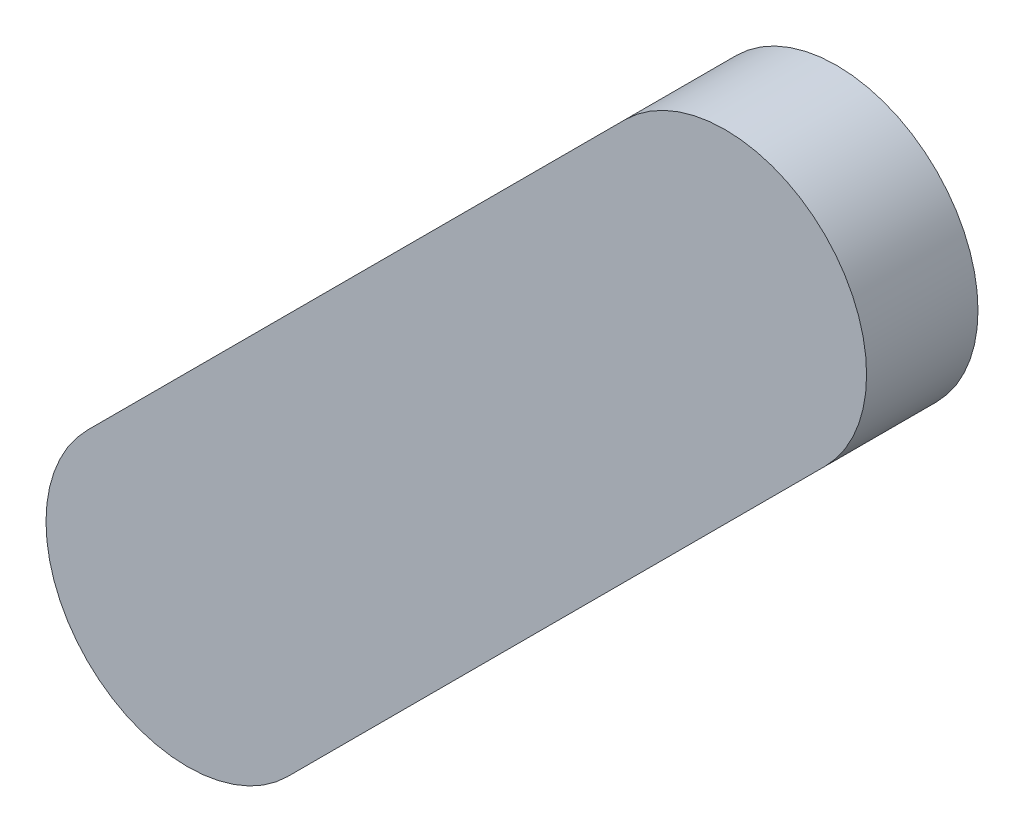
ISO-10303-21;
HEADER;
FILE_DESCRIPTION(('STEP AP214'),'2;1');
FILE_NAME('part.step','',(''),(''),'','','');
FILE_SCHEMA(('AUTOMOTIVE_DESIGN { 1 0 10303 214 1 1 1 1 }'));
ENDSEC;
DATA;
#1=APPLICATION_CONTEXT('core data for automotive mechanical design processes');
#2=APPLICATION_PROTOCOL_DEFINITION('international standard','automotive_design',2000,#1);
#3=PRODUCT_CONTEXT('',#1,'mechanical');
#4=PRODUCT('Part','Part','',(#3));
#5=PRODUCT_RELATED_PRODUCT_CATEGORY('part','',(#4));
#6=PRODUCT_DEFINITION_FORMATION('','',#4);
#7=PRODUCT_DEFINITION_CONTEXT('part definition',#1,'design');
#8=PRODUCT_DEFINITION('design','',#6,#7);
#9=PRODUCT_DEFINITION_SHAPE('','',#8);
#10=(LENGTH_UNIT() NAMED_UNIT(*) SI_UNIT(.MILLI.,.METRE.));
#11=(NAMED_UNIT(*) PLANE_ANGLE_UNIT() SI_UNIT($,.RADIAN.));
#12=(NAMED_UNIT(*) SI_UNIT($,.STERADIAN.) SOLID_ANGLE_UNIT());
#13=UNCERTAINTY_MEASURE_WITH_UNIT(LENGTH_MEASURE(1.E-05),#10,'distance_accuracy_value','');
#14=(GEOMETRIC_REPRESENTATION_CONTEXT(3) GLOBAL_UNCERTAINTY_ASSIGNED_CONTEXT((#13)) GLOBAL_UNIT_ASSIGNED_CONTEXT((#10,
#11,#12)) REPRESENTATION_CONTEXT('',''));
#15=CARTESIAN_POINT('',(0.,0.,0.));
#16=DIRECTION('',(0.,0.,1.));
#17=DIRECTION('',(1.,0.,0.));
#18=AXIS2_PLACEMENT_3D('',#15,#16,#17);
#19=CARTESIAN_POINT('',(147.8044034,106.62739406,0.));
#20=DIRECTION('',(-0.707106781186563,0.707106781186532,0.));
#21=DIRECTION('',(0.707106781186532,0.707106781186563,0.));
#22=AXIS2_PLACEMENT_3D('',#19,#20,#21);
#23=PLANE('',#22);
#24=DIRECTION('',(0.707106781186532,0.707106781186563,0.));
#25=VECTOR('',#24,1.);
#26=CARTESIAN_POINT('',(147.8044034,106.62739406,0.1999996));
#27=LINE('',#26,#25);
#28=CARTESIAN_POINT('',(147.8044034,106.62739406,0.1999996));
#29=VERTEX_POINT('',#28);
#30=CARTESIAN_POINT('',(148.76960594,107.5925966,0.1999996));
#31=VERTEX_POINT('',#30);
#32=EDGE_CURVE('E11',#29,#31,#27,.T.);
#33=ORIENTED_EDGE('',*,*,#32,.F.);
#34=DIRECTION('',(0.,0.,1.));
#35=VECTOR('',#34,1.);
#36=CARTESIAN_POINT('',(147.8044034,106.62739406,0.));
#37=LINE('',#36,#35);
#38=CARTESIAN_POINT('',(147.8044034,106.62739406,0.));
#39=VERTEX_POINT('',#38);
#40=EDGE_CURVE('E24',#39,#29,#37,.T.);
#41=ORIENTED_EDGE('',*,*,#40,.F.);
#42=DIRECTION('',(0.707106781186532,0.707106781186563,0.));
#43=VECTOR('',#42,1.);
#44=CARTESIAN_POINT('',(147.8044034,106.62739406,0.));
#45=LINE('',#44,#43);
#46=CARTESIAN_POINT('',(148.76960594,107.5925966,0.));
#47=VERTEX_POINT('',#46);
#48=EDGE_CURVE('E75',#39,#47,#45,.T.);
#49=ORIENTED_EDGE('',*,*,#48,.T.);
#50=DIRECTION('',(0.,0.,1.));
#51=VECTOR('',#50,1.);
#52=CARTESIAN_POINT('',(148.76960594,107.5925966,0.));
#53=LINE('',#52,#51);
#54=EDGE_CURVE('E37',#47,#31,#53,.T.);
#55=ORIENTED_EDGE('',*,*,#54,.T.);
#56=EDGE_LOOP('',(#33,#41,#49,#55));
#57=FACE_BOUND('',#56,.T.);
#58=ADVANCED_FACE('F17',(#57),#23,.F.);
#59=CARTESIAN_POINT('',(148.59000127,107.77220127,0.));
#60=DIRECTION('',(0.,0.,-1.));
#61=DIRECTION('',(0.70710678118652,-0.707106781186576,0.));
#62=AXIS2_PLACEMENT_3D('',#59,#60,#61);
#63=CYLINDRICAL_SURFACE('',#62,0.253999360179526);
#64=CARTESIAN_POINT('',(148.59000127,107.77220127,0.1999996));
#65=DIRECTION('',(0.,0.,1.));
#66=DIRECTION('',(0.70710678118652,-0.707106781186576,0.));
#67=AXIS2_PLACEMENT_3D('',#64,#65,#66);
#68=CIRCLE('',#67,0.253999360179526);
#69=CARTESIAN_POINT('',(148.4103966,107.95180594,0.1999996));
#70=VERTEX_POINT('',#69);
#71=EDGE_CURVE('E83',#31,#70,#68,.T.);
#72=ORIENTED_EDGE('',*,*,#71,.F.);
#73=ORIENTED_EDGE('',*,*,#54,.F.);
#74=CARTESIAN_POINT('',(148.59000127,107.77220127,0.));
#75=DIRECTION('',(0.,0.,1.));
#76=DIRECTION('',(0.70710678118652,-0.707106781186576,0.));
#77=AXIS2_PLACEMENT_3D('',#74,#75,#76);
#78=CIRCLE('',#77,0.253999360179526);
#79=CARTESIAN_POINT('',(148.4103966,107.95180594,0.));
#80=VERTEX_POINT('',#79);
#81=EDGE_CURVE('E81',#47,#80,#78,.T.);
#82=ORIENTED_EDGE('',*,*,#81,.T.);
#83=DIRECTION('',(0.,0.,1.));
#84=VECTOR('',#83,1.);
#85=CARTESIAN_POINT('',(148.4103966,107.95180594,0.));
#86=LINE('',#85,#84);
#87=EDGE_CURVE('E67',#80,#70,#86,.T.);
#88=ORIENTED_EDGE('',*,*,#87,.T.);
#89=EDGE_LOOP('',(#72,#73,#82,#88));
#90=FACE_BOUND('',#89,.T.);
#91=ADVANCED_FACE('F89',(#90),#63,.T.);
#92=CARTESIAN_POINT('',(148.4103966,107.95180594,0.));
#93=DIRECTION('',(0.707106781186532,-0.707106781186563,0.));
#94=DIRECTION('',(-0.707106781186563,-0.707106781186532,0.));
#95=AXIS2_PLACEMENT_3D('',#92,#93,#94);
#96=PLANE('',#95);
#97=DIRECTION('',(-0.707106781186563,-0.707106781186532,0.));
#98=VECTOR('',#97,1.);
#99=CARTESIAN_POINT('',(148.4103966,107.95180594,0.1999996));
#100=LINE('',#99,#98);
#101=CARTESIAN_POINT('',(147.44519406,106.9866034,0.1999996));
#102=VERTEX_POINT('',#101);
#103=EDGE_CURVE('E71',#70,#102,#100,.T.);
#104=ORIENTED_EDGE('',*,*,#103,.F.);
#105=ORIENTED_EDGE('',*,*,#87,.F.);
#106=DIRECTION('',(-0.707106781186563,-0.707106781186532,0.));
#107=VECTOR('',#106,1.);
#108=CARTESIAN_POINT('',(148.4103966,107.95180594,0.));
#109=LINE('',#108,#107);
#110=CARTESIAN_POINT('',(147.44519406,106.9866034,0.));
#111=VERTEX_POINT('',#110);
#112=EDGE_CURVE('E63',#80,#111,#109,.T.);
#113=ORIENTED_EDGE('',*,*,#112,.T.);
#114=DIRECTION('',(0.,0.,1.));
#115=VECTOR('',#114,1.);
#116=CARTESIAN_POINT('',(147.44519406,106.9866034,0.));
#117=LINE('',#116,#115);
#118=EDGE_CURVE('E53',#111,#102,#117,.T.);
#119=ORIENTED_EDGE('',*,*,#118,.T.);
#120=EDGE_LOOP('',(#104,#105,#113,#119));
#121=FACE_BOUND('',#120,.T.);
#122=ADVANCED_FACE('F66',(#121),#96,.F.);
#123=CARTESIAN_POINT('',(147.62479873,106.80699873,0.));
#124=DIRECTION('',(0.,0.,-1.));
#125=DIRECTION('',(-0.707106781186604,0.707106781186492,0.));
#126=AXIS2_PLACEMENT_3D('',#123,#124,#125);
#127=CYLINDRICAL_SURFACE('',#126,0.253999360179562);
#128=CARTESIAN_POINT('',(147.62479873,106.80699873,0.1999996));
#129=DIRECTION('',(0.,0.,1.));
#130=DIRECTION('',(-0.707106781186604,0.707106781186492,0.));
#131=AXIS2_PLACEMENT_3D('',#128,#129,#130);
#132=CIRCLE('',#131,0.253999360179562);
#133=EDGE_CURVE('E59',#102,#29,#132,.T.);
#134=ORIENTED_EDGE('',*,*,#133,.F.);
#135=ORIENTED_EDGE('',*,*,#118,.F.);
#136=CARTESIAN_POINT('',(147.62479873,106.80699873,0.));
#137=DIRECTION('',(0.,0.,1.));
#138=DIRECTION('',(-0.707106781186604,0.707106781186492,0.));
#139=AXIS2_PLACEMENT_3D('',#136,#137,#138);
#140=CIRCLE('',#139,0.253999360179562);
#141=EDGE_CURVE('E57',#111,#39,#140,.T.);
#142=ORIENTED_EDGE('',*,*,#141,.T.);
#143=ORIENTED_EDGE('',*,*,#40,.T.);
#144=EDGE_LOOP('',(#134,#135,#142,#143));
#145=FACE_BOUND('',#144,.T.);
#146=ADVANCED_FACE('F55',(#145),#127,.T.);
#147=CARTESIAN_POINT('',(147.8044034,106.62739406,0.));
#148=DIRECTION('',(0.,0.,-1.));
#149=DIRECTION('',(-1.,0.,0.));
#150=AXIS2_PLACEMENT_3D('',#147,#148,#149);
#151=PLANE('',#150);
#152=ORIENTED_EDGE('',*,*,#141,.F.);
#153=ORIENTED_EDGE('',*,*,#112,.F.);
#154=ORIENTED_EDGE('',*,*,#81,.F.);
#155=ORIENTED_EDGE('',*,*,#48,.F.);
#156=EDGE_LOOP('',(#152,#153,#154,#155));
#157=FACE_BOUND('',#156,.T.);
#158=ADVANCED_FACE('F74',(#157),#151,.T.);
#159=CARTESIAN_POINT('',(147.8044034,106.62739406,0.1999996));
#160=DIRECTION('',(0.,0.,-1.));
#161=DIRECTION('',(-1.,0.,0.));
#162=AXIS2_PLACEMENT_3D('',#159,#160,#161);
#163=PLANE('',#162);
#164=ORIENTED_EDGE('',*,*,#32,.T.);
#165=ORIENTED_EDGE('',*,*,#71,.T.);
#166=ORIENTED_EDGE('',*,*,#103,.T.);
#167=ORIENTED_EDGE('',*,*,#133,.T.);
#168=EDGE_LOOP('',(#164,#165,#166,#167));
#169=FACE_BOUND('',#168,.T.);
#170=ADVANCED_FACE('F91',(#169),#163,.F.);
#171=CLOSED_SHELL('',(#58,#91,#122,#146,#158,#170));
#172=MANIFOLD_SOLID_BREP('B1',#171);
#173=ADVANCED_BREP_SHAPE_REPRESENTATION('',(#18,#172),#14);
#174=SHAPE_DEFINITION_REPRESENTATION(#9,#173);
ENDSEC;
END-ISO-10303-21;
